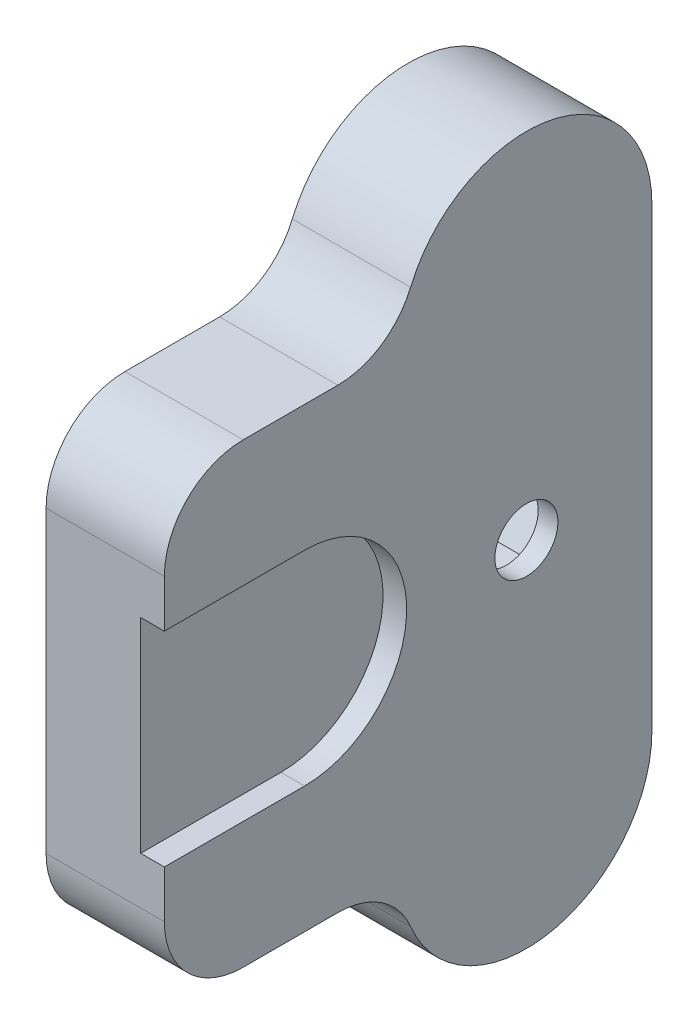
ISO-10303-21;
HEADER;
FILE_DESCRIPTION(('STEP AP214'),'2;1');
FILE_NAME('part.step','',(''),(''),'','','');
FILE_SCHEMA(('AUTOMOTIVE_DESIGN { 1 0 10303 214 1 1 1 1 }'));
ENDSEC;
DATA;
#1=APPLICATION_CONTEXT('core data for automotive mechanical design processes');
#2=APPLICATION_PROTOCOL_DEFINITION('international standard','automotive_design',2000,#1);
#3=PRODUCT_CONTEXT('',#1,'mechanical');
#4=PRODUCT('Part','Part','',(#3));
#5=PRODUCT_RELATED_PRODUCT_CATEGORY('part','',(#4));
#6=PRODUCT_DEFINITION_FORMATION('','',#4);
#7=PRODUCT_DEFINITION_CONTEXT('part definition',#1,'design');
#8=PRODUCT_DEFINITION('design','',#6,#7);
#9=PRODUCT_DEFINITION_SHAPE('','',#8);
#10=(LENGTH_UNIT() NAMED_UNIT(*) SI_UNIT(.MILLI.,.METRE.));
#11=(NAMED_UNIT(*) PLANE_ANGLE_UNIT() SI_UNIT($,.RADIAN.));
#12=(NAMED_UNIT(*) SI_UNIT($,.STERADIAN.) SOLID_ANGLE_UNIT());
#13=UNCERTAINTY_MEASURE_WITH_UNIT(LENGTH_MEASURE(1.E-05),#10,'distance_accuracy_value','');
#14=(GEOMETRIC_REPRESENTATION_CONTEXT(3) GLOBAL_UNCERTAINTY_ASSIGNED_CONTEXT((#13)) GLOBAL_UNIT_ASSIGNED_CONTEXT((#10,
#11,#12)) REPRESENTATION_CONTEXT('',''));
#15=CARTESIAN_POINT('',(0.,0.,0.));
#16=DIRECTION('',(0.,0.,1.));
#17=DIRECTION('',(1.,0.,0.));
#18=AXIS2_PLACEMENT_3D('',#15,#16,#17);
#19=CARTESIAN_POINT('',(15.,-28.9686177509747,3.13232637331732));
#20=DIRECTION('',(-1.,0.,0.));
#21=DIRECTION('',(0.,0.,1.));
#22=AXIS2_PLACEMENT_3D('',#19,#20,#21);
#23=CYLINDRICAL_SURFACE('',#22,15.921660548038);
#24=CARTESIAN_POINT('',(0.,-28.9686177509747,3.13232637331732));
#25=DIRECTION('',(1.,0.,0.));
#26=DIRECTION('',(0.,0.,-1.));
#27=AXIS2_PLACEMENT_3D('',#24,#25,#26);
#28=CIRCLE('',#27,15.921660548038);
#29=CARTESIAN_POINT('',(0.,-35.1108402056403,17.821518928538));
#30=VERTEX_POINT('',#29);
#31=CARTESIAN_POINT('',(0.,-28.9686177509747,-12.7893341747207));
#32=VERTEX_POINT('',#31);
#33=EDGE_CURVE('E253',#30,#32,#28,.T.);
#34=ORIENTED_EDGE('',*,*,#33,.T.);
#35=DIRECTION('',(-1.,0.,0.));
#36=VECTOR('',#35,1.);
#37=CARTESIAN_POINT('',(15.,-28.9686177509747,-12.7893341747207));
#38=LINE('',#37,#36);
#39=CARTESIAN_POINT('',(15.,-28.9686177509747,-12.7893341747207));
#40=VERTEX_POINT('',#39);
#41=EDGE_CURVE('E324',#40,#32,#38,.T.);
#42=ORIENTED_EDGE('',*,*,#41,.F.);
#43=CARTESIAN_POINT('',(15.,-28.9686177509747,3.13232637331732));
#44=DIRECTION('',(1.,0.,0.));
#45=DIRECTION('',(0.,0.,-1.));
#46=AXIS2_PLACEMENT_3D('',#43,#44,#45);
#47=CIRCLE('',#46,15.921660548038);
#48=CARTESIAN_POINT('',(15.,-35.1108402056403,17.821518928538));
#49=VERTEX_POINT('',#48);
#50=EDGE_CURVE('E254',#49,#40,#47,.T.);
#51=ORIENTED_EDGE('',*,*,#50,.F.);
#52=DIRECTION('',(-1.,0.,0.));
#53=VECTOR('',#52,1.);
#54=CARTESIAN_POINT('',(15.,-35.1108402056403,17.821518928538));
#55=LINE('',#54,#53);
#56=EDGE_CURVE('E278',#49,#30,#55,.T.);
#57=ORIENTED_EDGE('',*,*,#56,.T.);
#58=EDGE_LOOP('',(#34,#42,#51,#57));
#59=FACE_BOUND('',#58,.T.);
#60=ADVANCED_FACE('F44',(#59),#23,.T.);
#61=CARTESIAN_POINT('',(15.,-28.9686177509747,-12.7893341747207));
#62=DIRECTION('',(0.,0.,1.));
#63=DIRECTION('',(1.,0.,0.));
#64=AXIS2_PLACEMENT_3D('',#61,#62,#63);
#65=PLANE('',#64);
#66=DIRECTION('',(0.,1.,0.));
#67=VECTOR('',#66,1.);
#68=CARTESIAN_POINT('',(0.,-28.9686177509747,-12.7893341747207));
#69=LINE('',#68,#67);
#70=CARTESIAN_POINT('',(0.,28.9686177509747,-12.7893341747207));
#71=VERTEX_POINT('',#70);
#72=EDGE_CURVE('E281',#32,#71,#69,.T.);
#73=ORIENTED_EDGE('',*,*,#72,.T.);
#74=DIRECTION('',(-1.,0.,0.));
#75=VECTOR('',#74,1.);
#76=CARTESIAN_POINT('',(15.,28.9686177509747,-12.7893341747207));
#77=LINE('',#76,#75);
#78=CARTESIAN_POINT('',(15.,28.9686177509747,-12.7893341747207));
#79=VERTEX_POINT('',#78);
#80=EDGE_CURVE('E321',#79,#71,#77,.T.);
#81=ORIENTED_EDGE('',*,*,#80,.F.);
#82=DIRECTION('',(0.,1.,0.));
#83=VECTOR('',#82,1.);
#84=CARTESIAN_POINT('',(15.,-28.9686177509747,-12.7893341747207));
#85=LINE('',#84,#83);
#86=EDGE_CURVE('E257',#40,#79,#85,.T.);
#87=ORIENTED_EDGE('',*,*,#86,.F.);
#88=ORIENTED_EDGE('',*,*,#41,.T.);
#89=EDGE_LOOP('',(#73,#81,#87,#88));
#90=FACE_BOUND('',#89,.T.);
#91=ADVANCED_FACE('F363',(#90),#65,.F.);
#92=CARTESIAN_POINT('',(15.,28.9686177509747,3.13232637331732));
#93=DIRECTION('',(-1.,0.,0.));
#94=DIRECTION('',(0.,0.,1.));
#95=AXIS2_PLACEMENT_3D('',#92,#93,#94);
#96=CYLINDRICAL_SURFACE('',#95,15.921660548038);
#97=CARTESIAN_POINT('',(0.,28.9686177509747,3.13232637331732));
#98=DIRECTION('',(1.,0.,0.));
#99=DIRECTION('',(0.,0.,1.));
#100=AXIS2_PLACEMENT_3D('',#97,#98,#99);
#101=CIRCLE('',#100,15.921660548038);
#102=CARTESIAN_POINT('',(0.,35.1108402056403,17.821518928538));
#103=VERTEX_POINT('',#102);
#104=EDGE_CURVE('E283',#71,#103,#101,.T.);
#105=ORIENTED_EDGE('',*,*,#104,.T.);
#106=DIRECTION('',(-1.,0.,0.));
#107=VECTOR('',#106,1.);
#108=CARTESIAN_POINT('',(15.,35.1108402056403,17.821518928538));
#109=LINE('',#108,#107);
#110=CARTESIAN_POINT('',(15.,35.1108402056403,17.821518928538));
#111=VERTEX_POINT('',#110);
#112=EDGE_CURVE('E318',#111,#103,#109,.T.);
#113=ORIENTED_EDGE('',*,*,#112,.F.);
#114=CARTESIAN_POINT('',(15.,28.9686177509747,3.13232637331732));
#115=DIRECTION('',(1.,0.,0.));
#116=DIRECTION('',(0.,0.,1.));
#117=AXIS2_PLACEMENT_3D('',#114,#115,#116);
#118=CIRCLE('',#117,15.921660548038);
#119=EDGE_CURVE('E260',#79,#111,#118,.T.);
#120=ORIENTED_EDGE('',*,*,#119,.F.);
#121=ORIENTED_EDGE('',*,*,#80,.T.);
#122=EDGE_LOOP('',(#105,#113,#120,#121));
#123=FACE_BOUND('',#122,.T.);
#124=ADVANCED_FACE('F368',(#123),#96,.T.);
#125=CARTESIAN_POINT('',(15.,38.9686177509747,27.0474363577541));
#126=DIRECTION('',(-1.,0.,0.));
#127=DIRECTION('',(0.,0.,1.));
#128=AXIS2_PLACEMENT_3D('',#125,#126,#127);
#129=CYLINDRICAL_SURFACE('',#128,9.99999999999999);
#130=CARTESIAN_POINT('',(0.,38.9686177509747,27.0474363577541));
#131=DIRECTION('',(-1.,0.,0.));
#132=DIRECTION('',(0.,0.,1.));
#133=AXIS2_PLACEMENT_3D('',#130,#131,#132);
#134=CIRCLE('',#133,9.99999999999999);
#135=CARTESIAN_POINT('',(0.,28.9686177509747,27.0474363577541));
#136=VERTEX_POINT('',#135);
#137=EDGE_CURVE('E285',#103,#136,#134,.T.);
#138=ORIENTED_EDGE('',*,*,#137,.T.);
#139=DIRECTION('',(-1.,0.,0.));
#140=VECTOR('',#139,1.);
#141=CARTESIAN_POINT('',(15.,28.9686177509747,27.0474363577541));
#142=LINE('',#141,#140);
#143=CARTESIAN_POINT('',(15.,28.9686177509747,27.0474363577541));
#144=VERTEX_POINT('',#143);
#145=EDGE_CURVE('E315',#144,#136,#142,.T.);
#146=ORIENTED_EDGE('',*,*,#145,.F.);
#147=CARTESIAN_POINT('',(15.,38.9686177509747,27.0474363577541));
#148=DIRECTION('',(-1.,0.,0.));
#149=DIRECTION('',(0.,0.,1.));
#150=AXIS2_PLACEMENT_3D('',#147,#148,#149);
#151=CIRCLE('',#150,9.99999999999999);
#152=EDGE_CURVE('E262',#111,#144,#151,.T.);
#153=ORIENTED_EDGE('',*,*,#152,.F.);
#154=ORIENTED_EDGE('',*,*,#112,.T.);
#155=EDGE_LOOP('',(#138,#146,#153,#154));
#156=FACE_BOUND('',#155,.T.);
#157=ADVANCED_FACE('F416',(#156),#129,.F.);
#158=CARTESIAN_POINT('',(15.,28.9686177509747,39.0539869213552));
#159=DIRECTION('',(0.,-1.,0.));
#160=DIRECTION('',(0.,0.,-1.));
#161=AXIS2_PLACEMENT_3D('',#158,#159,#160);
#162=PLANE('',#161);
#163=DIRECTION('',(0.,0.,1.));
#164=VECTOR('',#163,1.);
#165=CARTESIAN_POINT('',(0.,28.9686177509747,39.0539869213552));
#166=LINE('',#165,#164);
#167=CARTESIAN_POINT('',(0.,28.9686177509747,39.0539869213552));
#168=VERTEX_POINT('',#167);
#169=EDGE_CURVE('E287',#136,#168,#166,.T.);
#170=ORIENTED_EDGE('',*,*,#169,.T.);
#171=DIRECTION('',(-1.,0.,0.));
#172=VECTOR('',#171,1.);
#173=CARTESIAN_POINT('',(15.,28.9686177509747,39.0539869213552));
#174=LINE('',#173,#172);
#175=CARTESIAN_POINT('',(15.,28.9686177509747,39.0539869213552));
#176=VERTEX_POINT('',#175);
#177=EDGE_CURVE('E312',#176,#168,#174,.T.);
#178=ORIENTED_EDGE('',*,*,#177,.F.);
#179=DIRECTION('',(0.,0.,1.));
#180=VECTOR('',#179,1.);
#181=CARTESIAN_POINT('',(15.,28.9686177509747,39.0539869213552));
#182=LINE('',#181,#180);
#183=EDGE_CURVE('E264',#144,#176,#182,.T.);
#184=ORIENTED_EDGE('',*,*,#183,.F.);
#185=ORIENTED_EDGE('',*,*,#145,.T.);
#186=EDGE_LOOP('',(#170,#178,#184,#185));
#187=FACE_BOUND('',#186,.T.);
#188=ADVANCED_FACE('F411',(#187),#162,.F.);
#189=CARTESIAN_POINT('',(15.,18.9686177509747,39.0539869213552));
#190=DIRECTION('',(-1.,0.,0.));
#191=DIRECTION('',(0.,0.,1.));
#192=AXIS2_PLACEMENT_3D('',#189,#190,#191);
#193=CYLINDRICAL_SURFACE('',#192,10.);
#194=CARTESIAN_POINT('',(0.,18.9686177509747,39.0539869213552));
#195=DIRECTION('',(1.,0.,0.));
#196=DIRECTION('',(0.,0.,1.));
#197=AXIS2_PLACEMENT_3D('',#194,#195,#196);
#198=CIRCLE('',#197,10.);
#199=CARTESIAN_POINT('',(0.,18.9686177509747,49.0539869213552));
#200=VERTEX_POINT('',#199);
#201=EDGE_CURVE('E289',#168,#200,#198,.T.);
#202=ORIENTED_EDGE('',*,*,#201,.T.);
#203=DIRECTION('',(-1.,0.,0.));
#204=VECTOR('',#203,1.);
#205=CARTESIAN_POINT('',(15.,18.9686177509747,49.0539869213552));
#206=LINE('',#205,#204);
#207=CARTESIAN_POINT('',(15.,18.9686177509747,49.0539869213552));
#208=VERTEX_POINT('',#207);
#209=EDGE_CURVE('E309',#208,#200,#206,.T.);
#210=ORIENTED_EDGE('',*,*,#209,.F.);
#211=CARTESIAN_POINT('',(15.,18.9686177509747,39.0539869213552));
#212=DIRECTION('',(1.,0.,0.));
#213=DIRECTION('',(0.,0.,1.));
#214=AXIS2_PLACEMENT_3D('',#211,#212,#213);
#215=CIRCLE('',#214,10.);
#216=EDGE_CURVE('E266',#176,#208,#215,.T.);
#217=ORIENTED_EDGE('',*,*,#216,.F.);
#218=ORIENTED_EDGE('',*,*,#177,.T.);
#219=EDGE_LOOP('',(#202,#210,#217,#218));
#220=FACE_BOUND('',#219,.T.);
#221=ADVANCED_FACE('F407',(#220),#193,.T.);
#222=CARTESIAN_POINT('',(15.,18.9686177509747,49.0539869213552));
#223=DIRECTION('',(0.,0.,-1.));
#224=DIRECTION('',(0.,1.,0.));
#225=AXIS2_PLACEMENT_3D('',#222,#223,#224);
#226=PLANE('',#225);
#227=DIRECTION('',(0.,-1.,0.));
#228=VECTOR('',#227,1.);
#229=CARTESIAN_POINT('',(12.,-12.95,49.0539869213552));
#230=LINE('',#229,#228);
#231=CARTESIAN_POINT('',(12.,12.95,49.0539869213552));
#232=VERTEX_POINT('',#231);
#233=CARTESIAN_POINT('',(12.,-12.95,49.0539869213552));
#234=VERTEX_POINT('',#233);
#235=EDGE_CURVE('E223',#232,#234,#230,.T.);
#236=ORIENTED_EDGE('',*,*,#235,.F.);
#237=DIRECTION('',(1.,0.,0.));
#238=VECTOR('',#237,1.);
#239=CARTESIAN_POINT('',(12.,12.95,49.0539869213552));
#240=LINE('',#239,#238);
#241=CARTESIAN_POINT('',(15.,12.95,49.0539869213552));
#242=VERTEX_POINT('',#241);
#243=EDGE_CURVE('E242',#232,#242,#240,.T.);
#244=ORIENTED_EDGE('',*,*,#243,.T.);
#245=DIRECTION('',(0.,-1.,0.));
#246=VECTOR('',#245,1.);
#247=CARTESIAN_POINT('',(15.,18.9686177509747,49.0539869213552));
#248=LINE('',#247,#246);
#249=EDGE_CURVE('E269',#208,#242,#248,.T.);
#250=ORIENTED_EDGE('',*,*,#249,.F.);
#251=ORIENTED_EDGE('',*,*,#209,.T.);
#252=DIRECTION('',(0.,-1.,0.));
#253=VECTOR('',#252,1.);
#254=CARTESIAN_POINT('',(0.,18.9686177509747,49.0539869213552));
#255=LINE('',#254,#253);
#256=CARTESIAN_POINT('',(0.,-18.9686177509747,49.0539869213552));
#257=VERTEX_POINT('',#256);
#258=EDGE_CURVE('E291',#200,#257,#255,.T.);
#259=ORIENTED_EDGE('',*,*,#258,.T.);
#260=DIRECTION('',(-1.,0.,0.));
#261=VECTOR('',#260,1.);
#262=CARTESIAN_POINT('',(15.,-18.9686177509747,49.0539869213552));
#263=LINE('',#262,#261);
#264=CARTESIAN_POINT('',(15.,-18.9686177509747,49.0539869213552));
#265=VERTEX_POINT('',#264);
#266=EDGE_CURVE('E306',#265,#257,#263,.T.);
#267=ORIENTED_EDGE('',*,*,#266,.F.);
#268=CARTESIAN_POINT('',(15.,-12.95,49.0539869213552));
#269=VERTEX_POINT('',#268);
#270=EDGE_CURVE('E268',#269,#265,#248,.T.);
#271=ORIENTED_EDGE('',*,*,#270,.F.);
#272=DIRECTION('',(1.,0.,0.));
#273=VECTOR('',#272,1.);
#274=CARTESIAN_POINT('',(12.,-12.95,49.0539869213552));
#275=LINE('',#274,#273);
#276=EDGE_CURVE('E66',#234,#269,#275,.T.);
#277=ORIENTED_EDGE('',*,*,#276,.F.);
#278=EDGE_LOOP('',(#236,#244,#250,#251,#259,#267,#271,#277));
#279=FACE_BOUND('',#278,.T.);
#280=ADVANCED_FACE('F402',(#279),#226,.F.);
#281=CARTESIAN_POINT('',(15.,-18.9686177509747,39.0539869213552));
#282=DIRECTION('',(-1.,0.,0.));
#283=DIRECTION('',(0.,0.,1.));
#284=AXIS2_PLACEMENT_3D('',#281,#282,#283);
#285=CYLINDRICAL_SURFACE('',#284,10.);
#286=CARTESIAN_POINT('',(0.,-18.9686177509747,39.0539869213552));
#287=DIRECTION('',(1.,0.,0.));
#288=DIRECTION('',(0.,0.,-1.));
#289=AXIS2_PLACEMENT_3D('',#286,#287,#288);
#290=CIRCLE('',#289,10.);
#291=CARTESIAN_POINT('',(0.,-28.9686177509747,39.0539869213552));
#292=VERTEX_POINT('',#291);
#293=EDGE_CURVE('E293',#257,#292,#290,.T.);
#294=ORIENTED_EDGE('',*,*,#293,.T.);
#295=DIRECTION('',(-1.,0.,0.));
#296=VECTOR('',#295,1.);
#297=CARTESIAN_POINT('',(15.,-28.9686177509747,39.0539869213552));
#298=LINE('',#297,#296);
#299=CARTESIAN_POINT('',(15.,-28.9686177509747,39.0539869213552));
#300=VERTEX_POINT('',#299);
#301=EDGE_CURVE('E303',#300,#292,#298,.T.);
#302=ORIENTED_EDGE('',*,*,#301,.F.);
#303=CARTESIAN_POINT('',(15.,-18.9686177509747,39.0539869213552));
#304=DIRECTION('',(1.,0.,0.));
#305=DIRECTION('',(0.,0.,-1.));
#306=AXIS2_PLACEMENT_3D('',#303,#304,#305);
#307=CIRCLE('',#306,10.);
#308=EDGE_CURVE('E272',#265,#300,#307,.T.);
#309=ORIENTED_EDGE('',*,*,#308,.F.);
#310=ORIENTED_EDGE('',*,*,#266,.T.);
#311=EDGE_LOOP('',(#294,#302,#309,#310));
#312=FACE_BOUND('',#311,.T.);
#313=ADVANCED_FACE('F396',(#312),#285,.T.);
#314=CARTESIAN_POINT('',(15.,-28.9686177509747,39.0539869213552));
#315=DIRECTION('',(0.,1.,0.));
#316=DIRECTION('',(0.,0.,1.));
#317=AXIS2_PLACEMENT_3D('',#314,#315,#316);
#318=PLANE('',#317);
#319=DIRECTION('',(0.,0.,-1.));
#320=VECTOR('',#319,1.);
#321=CARTESIAN_POINT('',(0.,-28.9686177509747,39.0539869213552));
#322=LINE('',#321,#320);
#323=CARTESIAN_POINT('',(0.,-28.9686177509747,27.0474363577541));
#324=VERTEX_POINT('',#323);
#325=EDGE_CURVE('E295',#292,#324,#322,.T.);
#326=ORIENTED_EDGE('',*,*,#325,.T.);
#327=DIRECTION('',(-1.,0.,0.));
#328=VECTOR('',#327,1.);
#329=CARTESIAN_POINT('',(15.,-28.9686177509747,27.0474363577541));
#330=LINE('',#329,#328);
#331=CARTESIAN_POINT('',(15.,-28.9686177509747,27.0474363577541));
#332=VERTEX_POINT('',#331);
#333=EDGE_CURVE('E300',#332,#324,#330,.T.);
#334=ORIENTED_EDGE('',*,*,#333,.F.);
#335=DIRECTION('',(0.,0.,-1.));
#336=VECTOR('',#335,1.);
#337=CARTESIAN_POINT('',(15.,-28.9686177509747,39.0539869213552));
#338=LINE('',#337,#336);
#339=EDGE_CURVE('E274',#300,#332,#338,.T.);
#340=ORIENTED_EDGE('',*,*,#339,.F.);
#341=ORIENTED_EDGE('',*,*,#301,.T.);
#342=EDGE_LOOP('',(#326,#334,#340,#341));
#343=FACE_BOUND('',#342,.T.);
#344=ADVANCED_FACE('F390',(#343),#318,.F.);
#345=CARTESIAN_POINT('',(15.,-38.9686177509747,27.0474363577541));
#346=DIRECTION('',(-1.,0.,0.));
#347=DIRECTION('',(0.,0.,1.));
#348=AXIS2_PLACEMENT_3D('',#345,#346,#347);
#349=CYLINDRICAL_SURFACE('',#348,9.99999999999999);
#350=CARTESIAN_POINT('',(0.,-38.9686177509747,27.0474363577541));
#351=DIRECTION('',(-1.,0.,0.));
#352=DIRECTION('',(0.,0.,-1.));
#353=AXIS2_PLACEMENT_3D('',#350,#351,#352);
#354=CIRCLE('',#353,9.99999999999999);
#355=EDGE_CURVE('E258',#324,#30,#354,.T.);
#356=ORIENTED_EDGE('',*,*,#355,.T.);
#357=ORIENTED_EDGE('',*,*,#56,.F.);
#358=CARTESIAN_POINT('',(15.,-38.9686177509747,27.0474363577541));
#359=DIRECTION('',(-1.,0.,0.));
#360=DIRECTION('',(0.,0.,-1.));
#361=AXIS2_PLACEMENT_3D('',#358,#359,#360);
#362=CIRCLE('',#361,9.99999999999999);
#363=EDGE_CURVE('E276',#332,#49,#362,.T.);
#364=ORIENTED_EDGE('',*,*,#363,.F.);
#365=ORIENTED_EDGE('',*,*,#333,.T.);
#366=EDGE_LOOP('',(#356,#357,#364,#365));
#367=FACE_BOUND('',#366,.T.);
#368=ADVANCED_FACE('F388',(#367),#349,.F.);
#369=CARTESIAN_POINT('',(15.,-28.9686177509747,3.13232637331732));
#370=DIRECTION('',(1.,0.,0.));
#371=DIRECTION('',(0.,0.,-1.));
#372=AXIS2_PLACEMENT_3D('',#369,#370,#371);
#373=PLANE('',#372);
#374=DIRECTION('',(0.,0.,1.));
#375=VECTOR('',#374,1.);
#376=CARTESIAN_POINT('',(15.,12.95,31.2677038838304));
#377=LINE('',#376,#375);
#378=CARTESIAN_POINT('',(15.,12.95,31.2677038838304));
#379=VERTEX_POINT('',#378);
#380=EDGE_CURVE('E227',#379,#242,#377,.T.);
#381=ORIENTED_EDGE('',*,*,#380,.F.);
#382=CARTESIAN_POINT('',(15.,0.,31.2677038838304));
#383=DIRECTION('',(1.,0.,0.));
#384=DIRECTION('',(0.,0.,-1.));
#385=AXIS2_PLACEMENT_3D('',#382,#383,#384);
#386=CIRCLE('',#385,12.95);
#387=CARTESIAN_POINT('',(15.,-12.95,31.2677038838304));
#388=VERTEX_POINT('',#387);
#389=EDGE_CURVE('E238',#388,#379,#386,.T.);
#390=ORIENTED_EDGE('',*,*,#389,.F.);
#391=DIRECTION('',(0.,0.,-1.));
#392=VECTOR('',#391,1.);
#393=CARTESIAN_POINT('',(15.,-12.95,49.0539869213552));
#394=LINE('',#393,#392);
#395=EDGE_CURVE('E236',#269,#388,#394,.T.);
#396=ORIENTED_EDGE('',*,*,#395,.F.);
#397=ORIENTED_EDGE('',*,*,#270,.T.);
#398=ORIENTED_EDGE('',*,*,#308,.T.);
#399=ORIENTED_EDGE('',*,*,#339,.T.);
#400=ORIENTED_EDGE('',*,*,#363,.T.);
#401=ORIENTED_EDGE('',*,*,#50,.T.);
#402=ORIENTED_EDGE('',*,*,#86,.T.);
#403=ORIENTED_EDGE('',*,*,#119,.T.);
#404=ORIENTED_EDGE('',*,*,#152,.T.);
#405=ORIENTED_EDGE('',*,*,#183,.T.);
#406=ORIENTED_EDGE('',*,*,#216,.T.);
#407=ORIENTED_EDGE('',*,*,#249,.T.);
#408=EDGE_LOOP('',(#381,#390,#396,#397,#398,#399,#400,#401,#402,#403,#404,#405,#406,#407));
#409=FACE_BOUND('',#408,.T.);
#410=CARTESIAN_POINT('',(15.,0.,3.13232637331727));
#411=DIRECTION('',(1.,0.,0.));
#412=DIRECTION('',(0.,0.,-1.));
#413=AXIS2_PLACEMENT_3D('',#410,#411,#412);
#414=CIRCLE('',#413,4.);
#415=CARTESIAN_POINT('',(15.,0.,-0.867673626682733));
#416=VERTEX_POINT('',#415);
#417=EDGE_CURVE('E245',#416,#416,#414,.T.);
#418=ORIENTED_EDGE('',*,*,#417,.F.);
#419=EDGE_LOOP('',(#418));
#420=FACE_BOUND('',#419,.T.);
#421=ADVANCED_FACE('F382',(#409,#420),#373,.T.);
#422=CARTESIAN_POINT('',(0.,-28.9686177509747,3.13232637331732));
#423=DIRECTION('',(1.,0.,0.));
#424=DIRECTION('',(0.,0.,-1.));
#425=AXIS2_PLACEMENT_3D('',#422,#423,#424);
#426=PLANE('',#425);
#427=DIRECTION('',(0.,0.845327020739453,0.534249219005289));
#428=VECTOR('',#427,1.);
#429=CARTESIAN_POINT('',(0.,-17.7085347037566,-14.684175957385));
#430=LINE('',#429,#428);
#431=CARTESIAN_POINT('',(0.,0.258716841757371,-3.32881895310315));
#432=VERTEX_POINT('',#431);
#433=CARTESIAN_POINT('',(0.,5.72487441110187,0.125809067455821));
#434=VERTEX_POINT('',#433);
#435=EDGE_CURVE('E51',#432,#434,#430,.T.);
#436=ORIENTED_EDGE('',*,*,#435,.T.);
#437=DIRECTION('',(0.,-0.040009885240851,0.999199283968426));
#438=VECTOR('',#437,1.);
#439=CARTESIAN_POINT('',(0.,5.54914329004977,4.51448474770838));
#440=LINE('',#439,#438);
#441=CARTESIAN_POINT('',(0.,5.4661575693445,6.58695439387624));
#442=VERTEX_POINT('',#441);
#443=EDGE_CURVE('E11',#434,#442,#440,.T.);
#444=ORIENTED_EDGE('',*,*,#443,.T.);
#445=DIRECTION('',(0.,-0.885336905980303,0.464950064963136));
#446=VECTOR('',#445,1.);
#447=CARTESIAN_POINT('',(0.,-20.1025032323088,20.014781044326));
#448=LINE('',#447,#446);
#449=CARTESIAN_POINT('',(0.,-0.258716841757364,9.59347169973769));
#450=VERTEX_POINT('',#449);
#451=EDGE_CURVE('E184',#442,#450,#448,.T.);
#452=ORIENTED_EDGE('',*,*,#451,.T.);
#453=DIRECTION('',(0.,-0.845327020739452,-0.53424921900529));
#454=VECTOR('',#453,1.);
#455=CARTESIAN_POINT('',(0.,-23.6921259566159,-5.21651332510313));
#456=LINE('',#455,#454);
#457=CARTESIAN_POINT('',(0.,-5.72487441110187,6.13884367917871));
#458=VERTEX_POINT('',#457);
#459=EDGE_CURVE('E330',#450,#458,#456,.T.);
#460=ORIENTED_EDGE('',*,*,#459,.T.);
#461=DIRECTION('',(0.,0.0400098852408509,-0.999199283968426));
#462=VECTOR('',#461,1.);
#463=CARTESIAN_POINT('',(0.,-5.64188869039658,4.06637403301085));
#464=LINE('',#463,#462);
#465=CARTESIAN_POINT('',(0.,-5.46615756934448,-0.322301647241716));
#466=VERTEX_POINT('',#465);
#467=EDGE_CURVE('E333',#458,#466,#464,.T.);
#468=ORIENTED_EDGE('',*,*,#467,.T.);
#469=DIRECTION('',(0.,0.885336905980303,-0.464950064963136));
#470=VECTOR('',#469,1.);
#471=CARTESIAN_POINT('',(0.,-25.3099439598959,10.0990076973466));
#472=LINE('',#471,#470);
#473=EDGE_CURVE('E336',#466,#432,#472,.T.);
#474=ORIENTED_EDGE('',*,*,#473,.T.);
#475=EDGE_LOOP('',(#436,#444,#452,#460,#468,#474));
#476=FACE_BOUND('',#475,.T.);
#477=ORIENTED_EDGE('',*,*,#33,.F.);
#478=ORIENTED_EDGE('',*,*,#355,.F.);
#479=ORIENTED_EDGE('',*,*,#325,.F.);
#480=ORIENTED_EDGE('',*,*,#293,.F.);
#481=ORIENTED_EDGE('',*,*,#258,.F.);
#482=ORIENTED_EDGE('',*,*,#201,.F.);
#483=ORIENTED_EDGE('',*,*,#169,.F.);
#484=ORIENTED_EDGE('',*,*,#137,.F.);
#485=ORIENTED_EDGE('',*,*,#104,.F.);
#486=ORIENTED_EDGE('',*,*,#72,.F.);
#487=EDGE_LOOP('',(#477,#478,#479,#480,#481,#482,#483,#484,#485,#486));
#488=FACE_BOUND('',#487,.T.);
#489=ADVANCED_FACE('F340',(#476,#488),#426,.F.);
#490=CARTESIAN_POINT('',(0.953799999999999,0.,3.13232637331727));
#491=DIRECTION('',(1.,0.,0.));
#492=DIRECTION('',(0.,0.,-1.));
#493=AXIS2_PLACEMENT_3D('',#490,#491,#492);
#494=CYLINDRICAL_SURFACE('',#493,4.);
#495=CARTESIAN_POINT('',(12.5,0.,3.13232637331727));
#496=DIRECTION('',(1.,0.,0.));
#497=DIRECTION('',(0.,0.,-1.));
#498=AXIS2_PLACEMENT_3D('',#495,#496,#497);
#499=CIRCLE('',#498,4.);
#500=CARTESIAN_POINT('',(12.5,0.,-0.867673626682733));
#501=VERTEX_POINT('',#500);
#502=EDGE_CURVE('E215',#501,#501,#499,.F.);
#503=CARTESIAN_POINT('',(12.5,0.,-0.867673626682733));
#504=CARTESIAN_POINT('',(12.5260416666667,0.,-0.867673626682733));
#505=CARTESIAN_POINT('',(12.5520833333333,0.,-0.867673626682733));
#506=CARTESIAN_POINT('',(12.6041666666667,0.,-0.867673626682733));
#507=CARTESIAN_POINT('',(12.6302083333333,0.,-0.867673626682733));
#508=CARTESIAN_POINT('',(12.6822916666667,0.,-0.867673626682733));
#509=CARTESIAN_POINT('',(12.7083333333333,0.,-0.867673626682733));
#510=CARTESIAN_POINT('',(12.7604166666667,0.,-0.867673626682733));
#511=CARTESIAN_POINT('',(12.7864583333333,0.,-0.867673626682733));
#512=CARTESIAN_POINT('',(12.8385416666667,0.,-0.867673626682733));
#513=CARTESIAN_POINT('',(12.8645833333333,0.,-0.867673626682733));
#514=CARTESIAN_POINT('',(12.9166666666667,0.,-0.867673626682733));
#515=CARTESIAN_POINT('',(12.9427083333333,0.,-0.867673626682733));
#516=CARTESIAN_POINT('',(12.9947916666667,0.,-0.867673626682733));
#517=CARTESIAN_POINT('',(13.0208333333333,0.,-0.867673626682733));
#518=CARTESIAN_POINT('',(13.0729166666667,0.,-0.867673626682733));
#519=CARTESIAN_POINT('',(13.0989583333333,0.,-0.867673626682733));
#520=CARTESIAN_POINT('',(13.1510416666667,0.,-0.867673626682733));
#521=CARTESIAN_POINT('',(13.1770833333333,0.,-0.867673626682733));
#522=CARTESIAN_POINT('',(13.2291666666667,0.,-0.867673626682733));
#523=CARTESIAN_POINT('',(13.2552083333333,0.,-0.867673626682733));
#524=CARTESIAN_POINT('',(13.3072916666667,0.,-0.867673626682733));
#525=CARTESIAN_POINT('',(13.3333333333333,0.,-0.867673626682733));
#526=CARTESIAN_POINT('',(13.3854166666667,0.,-0.867673626682733));
#527=CARTESIAN_POINT('',(13.4114583333333,0.,-0.867673626682733));
#528=CARTESIAN_POINT('',(13.4635416666667,0.,-0.867673626682733));
#529=CARTESIAN_POINT('',(13.4895833333333,0.,-0.867673626682733));
#530=CARTESIAN_POINT('',(13.5416666666667,0.,-0.867673626682733));
#531=CARTESIAN_POINT('',(13.5677083333333,0.,-0.867673626682733));
#532=CARTESIAN_POINT('',(13.6197916666667,0.,-0.867673626682733));
#533=CARTESIAN_POINT('',(13.6458333333333,0.,-0.867673626682733));
#534=CARTESIAN_POINT('',(13.6979166666667,0.,-0.867673626682733));
#535=CARTESIAN_POINT('',(13.7239583333333,0.,-0.867673626682733));
#536=CARTESIAN_POINT('',(13.7760416666667,0.,-0.867673626682733));
#537=CARTESIAN_POINT('',(13.8020833333333,0.,-0.867673626682733));
#538=CARTESIAN_POINT('',(13.8541666666667,0.,-0.867673626682733));
#539=CARTESIAN_POINT('',(13.8802083333333,0.,-0.867673626682733));
#540=CARTESIAN_POINT('',(13.9322916666667,0.,-0.867673626682733));
#541=CARTESIAN_POINT('',(13.9583333333333,0.,-0.867673626682733));
#542=CARTESIAN_POINT('',(14.0104166666667,0.,-0.867673626682733));
#543=CARTESIAN_POINT('',(14.0364583333333,0.,-0.867673626682733));
#544=CARTESIAN_POINT('',(14.0885416666667,0.,-0.867673626682733));
#545=CARTESIAN_POINT('',(14.1145833333333,0.,-0.867673626682733));
#546=CARTESIAN_POINT('',(14.1666666666667,0.,-0.867673626682733));
#547=CARTESIAN_POINT('',(14.1927083333333,0.,-0.867673626682733));
#548=CARTESIAN_POINT('',(14.2447916666667,0.,-0.867673626682733));
#549=CARTESIAN_POINT('',(14.2708333333333,0.,-0.867673626682733));
#550=CARTESIAN_POINT('',(14.3229166666667,0.,-0.867673626682733));
#551=CARTESIAN_POINT('',(14.3489583333333,0.,-0.867673626682733));
#552=CARTESIAN_POINT('',(14.4010416666667,0.,-0.867673626682733));
#553=CARTESIAN_POINT('',(14.4270833333333,0.,-0.867673626682733));
#554=CARTESIAN_POINT('',(14.4791666666667,0.,-0.867673626682733));
#555=CARTESIAN_POINT('',(14.5052083333333,0.,-0.867673626682733));
#556=CARTESIAN_POINT('',(14.5572916666667,0.,-0.867673626682733));
#557=CARTESIAN_POINT('',(14.5833333333333,0.,-0.867673626682733));
#558=CARTESIAN_POINT('',(14.6354166666667,0.,-0.867673626682733));
#559=CARTESIAN_POINT('',(14.6614583333333,0.,-0.867673626682733));
#560=CARTESIAN_POINT('',(14.7135416666667,0.,-0.867673626682733));
#561=CARTESIAN_POINT('',(14.7395833333333,0.,-0.867673626682733));
#562=CARTESIAN_POINT('',(14.7916666666667,0.,-0.867673626682733));
#563=CARTESIAN_POINT('',(14.8177083333333,0.,-0.867673626682733));
#564=CARTESIAN_POINT('',(14.8697916666667,0.,-0.867673626682733));
#565=CARTESIAN_POINT('',(14.8958333333333,0.,-0.867673626682733));
#566=CARTESIAN_POINT('',(14.9479166666667,0.,-0.867673626682733));
#567=CARTESIAN_POINT('',(14.9739583333333,0.,-0.867673626682733));
#568=CARTESIAN_POINT('',(15.,0.,-0.867673626682733));
#569=B_SPLINE_CURVE_WITH_KNOTS('',3,(#503,#504,#505,#506,#507,#508,#509,#510,#511,#512,#513,
#514,#515,#516,#517,#518,#519,#520,#521,#522,#523,#524,#525,#526,#527,#528,#529,#530,#531,#532,
#533,#534,#535,#536,#537,#538,#539,#540,#541,#542,#543,#544,#545,#546,#547,#548,#549,#550,#551,
#552,#553,#554,#555,#556,#557,#558,#559,#560,#561,#562,#563,#564,#565,#566,#567,#568),
.UNSPECIFIED.,.F.,.F.,(4,2,2,2,2,2,2,2,2,2,2,2,2,2,2,2,2,2,2,2,2,2,2,2,2,2,2,2,2,2,2,2,4),(0.,
0.0781250000000001,0.15625,0.234375,0.3125,0.390625,0.46875,0.546875,0.625000000000001,
0.703124999999999,0.781249999999999,0.859374999999999,0.937499999999999,1.015625,1.09375,
1.171875,1.25,1.328125,1.40625,1.484375,1.5625,1.640625,1.71875,1.796875,1.875,1.953125,2.03125,
2.109375,2.1875,2.265625,2.34375,2.421875,2.5),.UNSPECIFIED.);
#570=EDGE_CURVE('BSEAM439',#501,#416,#569,.T.);
#571=ORIENTED_EDGE('',*,*,#502,.T.);
#572=ORIENTED_EDGE('',*,*,#417,.T.);
#573=ORIENTED_EDGE('',*,*,#570,.T.);
#574=ORIENTED_EDGE('',*,*,#570,.F.);
#575=EDGE_LOOP('',(#571,#573,#572,#574));
#576=FACE_BOUND('',#575,.T.);
#577=ADVANCED_FACE('F439',(#576),#494,.F.);
#578=CARTESIAN_POINT('',(12.,12.95,31.2677038838304));
#579=DIRECTION('',(0.,1.,0.));
#580=DIRECTION('',(0.,0.,1.));
#581=AXIS2_PLACEMENT_3D('',#578,#579,#580);
#582=PLANE('',#581);
#583=ORIENTED_EDGE('',*,*,#380,.T.);
#584=ORIENTED_EDGE('',*,*,#243,.F.);
#585=DIRECTION('',(0.,0.,1.));
#586=VECTOR('',#585,1.);
#587=CARTESIAN_POINT('',(12.,12.95,31.2677038838304));
#588=LINE('',#587,#586);
#589=CARTESIAN_POINT('',(12.,12.95,31.2677038838304));
#590=VERTEX_POINT('',#589);
#591=EDGE_CURVE('E233',#590,#232,#588,.T.);
#592=ORIENTED_EDGE('',*,*,#591,.F.);
#593=DIRECTION('',(1.,0.,0.));
#594=VECTOR('',#593,1.);
#595=CARTESIAN_POINT('',(12.,12.95,31.2677038838304));
#596=LINE('',#595,#594);
#597=EDGE_CURVE('E246',#590,#379,#596,.T.);
#598=ORIENTED_EDGE('',*,*,#597,.T.);
#599=EDGE_LOOP('',(#583,#584,#592,#598));
#600=FACE_BOUND('',#599,.T.);
#601=ADVANCED_FACE('F421',(#600),#582,.F.);
#602=CARTESIAN_POINT('',(12.,0.,31.2677038838304));
#603=DIRECTION('',(1.,0.,0.));
#604=DIRECTION('',(0.,0.,-1.));
#605=AXIS2_PLACEMENT_3D('',#602,#603,#604);
#606=CYLINDRICAL_SURFACE('',#605,12.95);
#607=ORIENTED_EDGE('',*,*,#389,.T.);
#608=ORIENTED_EDGE('',*,*,#597,.F.);
#609=CARTESIAN_POINT('',(12.,0.,31.2677038838304));
#610=DIRECTION('',(1.,0.,0.));
#611=DIRECTION('',(0.,0.,-1.));
#612=AXIS2_PLACEMENT_3D('',#609,#610,#611);
#613=CIRCLE('',#612,12.95);
#614=CARTESIAN_POINT('',(12.,-12.95,31.2677038838304));
#615=VERTEX_POINT('',#614);
#616=EDGE_CURVE('E230',#615,#590,#613,.T.);
#617=ORIENTED_EDGE('',*,*,#616,.F.);
#618=DIRECTION('',(1.,0.,0.));
#619=VECTOR('',#618,1.);
#620=CARTESIAN_POINT('',(12.,-12.95,31.2677038838304));
#621=LINE('',#620,#619);
#622=EDGE_CURVE('E248',#615,#388,#621,.T.);
#623=ORIENTED_EDGE('',*,*,#622,.T.);
#624=EDGE_LOOP('',(#607,#608,#617,#623));
#625=FACE_BOUND('',#624,.T.);
#626=ADVANCED_FACE('F427',(#625),#606,.F.);
#627=CARTESIAN_POINT('',(12.,-12.95,49.0539869213552));
#628=DIRECTION('',(0.,-1.,0.));
#629=DIRECTION('',(0.,0.,-1.));
#630=AXIS2_PLACEMENT_3D('',#627,#628,#629);
#631=PLANE('',#630);
#632=ORIENTED_EDGE('',*,*,#395,.T.);
#633=ORIENTED_EDGE('',*,*,#622,.F.);
#634=DIRECTION('',(0.,0.,-1.));
#635=VECTOR('',#634,1.);
#636=CARTESIAN_POINT('',(12.,-12.95,49.0539869213552));
#637=LINE('',#636,#635);
#638=EDGE_CURVE('E226',#234,#615,#637,.T.);
#639=ORIENTED_EDGE('',*,*,#638,.F.);
#640=ORIENTED_EDGE('',*,*,#276,.T.);
#641=EDGE_LOOP('',(#632,#633,#639,#640));
#642=FACE_BOUND('',#641,.T.);
#643=ADVANCED_FACE('F428',(#642),#631,.F.);
#644=CARTESIAN_POINT('',(12.,0.,31.2677038838304));
#645=DIRECTION('',(1.,0.,0.));
#646=DIRECTION('',(0.,0.,-1.));
#647=AXIS2_PLACEMENT_3D('',#644,#645,#646);
#648=PLANE('',#647);
#649=ORIENTED_EDGE('',*,*,#235,.T.);
#650=ORIENTED_EDGE('',*,*,#638,.T.);
#651=ORIENTED_EDGE('',*,*,#616,.T.);
#652=ORIENTED_EDGE('',*,*,#591,.T.);
#653=EDGE_LOOP('',(#649,#650,#651,#652));
#654=FACE_BOUND('',#653,.T.);
#655=ADVANCED_FACE('F424',(#654),#648,.T.);
#656=CARTESIAN_POINT('',(-12.5,5.54914329004977,4.51448474770838));
#657=DIRECTION('',(0.,0.999199283968425,0.040009885240851));
#658=DIRECTION('',(0.,-0.040009885240851,0.999199283968426));
#659=AXIS2_PLACEMENT_3D('',#656,#657,#658);
#660=PLANE('',#659);
#661=DIRECTION('',(1.,0.,0.));
#662=VECTOR('',#661,1.);
#663=CARTESIAN_POINT('',(-12.5,5.72487441110187,0.125809067455821));
#664=LINE('',#663,#662);
#665=CARTESIAN_POINT('',(12.5,5.72487441110187,0.125809067455821));
#666=VERTEX_POINT('',#665);
#667=EDGE_CURVE('E203',#434,#666,#664,.T.);
#668=ORIENTED_EDGE('',*,*,#667,.T.);
#669=DIRECTION('',(0.,-0.040009885240851,0.999199283968426));
#670=VECTOR('',#669,1.);
#671=CARTESIAN_POINT('',(12.5,5.54914329004977,4.51448474770838));
#672=LINE('',#671,#670);
#673=CARTESIAN_POINT('',(12.5,5.4661575693445,6.58695439387624));
#674=VERTEX_POINT('',#673);
#675=EDGE_CURVE('E195',#666,#674,#672,.T.);
#676=ORIENTED_EDGE('',*,*,#675,.T.);
#677=DIRECTION('',(1.,0.,0.));
#678=VECTOR('',#677,1.);
#679=CARTESIAN_POINT('',(-12.5,5.4661575693445,6.58695439387624));
#680=LINE('',#679,#678);
#681=EDGE_CURVE('E179',#442,#674,#680,.T.);
#682=ORIENTED_EDGE('',*,*,#681,.F.);
#683=ORIENTED_EDGE('',*,*,#443,.F.);
#684=EDGE_LOOP('',(#668,#676,#682,#683));
#685=FACE_BOUND('',#684,.T.);
#686=ADVANCED_FACE('F201',(#685),#660,.F.);
#687=CARTESIAN_POINT('',(-12.5,-17.7085347037566,-14.684175957385));
#688=DIRECTION('',(0.,0.534249219005289,-0.845327020739453));
#689=DIRECTION('',(0.,0.845327020739453,0.534249219005289));
#690=AXIS2_PLACEMENT_3D('',#687,#688,#689);
#691=PLANE('',#690);
#692=DIRECTION('',(1.,0.,0.));
#693=VECTOR('',#692,1.);
#694=CARTESIAN_POINT('',(-12.5,0.258716841757371,-3.32881895310315));
#695=LINE('',#694,#693);
#696=CARTESIAN_POINT('',(12.5,0.258716841757371,-3.32881895310315));
#697=VERTEX_POINT('',#696);
#698=EDGE_CURVE('E216',#432,#697,#695,.T.);
#699=ORIENTED_EDGE('',*,*,#698,.T.);
#700=DIRECTION('',(0.,0.845327020739452,0.534249219005289));
#701=VECTOR('',#700,1.);
#702=CARTESIAN_POINT('',(12.5,-17.7085347037566,-14.684175957385));
#703=LINE('',#702,#701);
#704=EDGE_CURVE('E187',#697,#666,#703,.T.);
#705=ORIENTED_EDGE('',*,*,#704,.T.);
#706=ORIENTED_EDGE('',*,*,#667,.F.);
#707=ORIENTED_EDGE('',*,*,#435,.F.);
#708=EDGE_LOOP('',(#699,#705,#706,#707));
#709=FACE_BOUND('',#708,.T.);
#710=ADVANCED_FACE('F344',(#709),#691,.F.);
#711=CARTESIAN_POINT('',(-12.5,-25.3099439598959,10.0990076973466));
#712=DIRECTION('',(0.,-0.464950064963136,-0.885336905980303));
#713=DIRECTION('',(0.,0.885336905980303,-0.464950064963136));
#714=AXIS2_PLACEMENT_3D('',#711,#712,#713);
#715=PLANE('',#714);
#716=DIRECTION('',(1.,0.,0.));
#717=VECTOR('',#716,1.);
#718=CARTESIAN_POINT('',(-12.5,-5.46615756934448,-0.322301647241716));
#719=LINE('',#718,#717);
#720=CARTESIAN_POINT('',(12.5,-5.46615756934448,-0.322301647241716));
#721=VERTEX_POINT('',#720);
#722=EDGE_CURVE('E218',#466,#721,#719,.T.);
#723=ORIENTED_EDGE('',*,*,#722,.T.);
#724=DIRECTION('',(0.,0.885336905980303,-0.464950064963136));
#725=VECTOR('',#724,1.);
#726=CARTESIAN_POINT('',(12.5,-25.3099439598959,10.0990076973466));
#727=LINE('',#726,#725);
#728=EDGE_CURVE('E210',#721,#697,#727,.T.);
#729=ORIENTED_EDGE('',*,*,#728,.T.);
#730=ORIENTED_EDGE('',*,*,#698,.F.);
#731=ORIENTED_EDGE('',*,*,#473,.F.);
#732=EDGE_LOOP('',(#723,#729,#730,#731));
#733=FACE_BOUND('',#732,.T.);
#734=ADVANCED_FACE('F346',(#733),#715,.F.);
#735=CARTESIAN_POINT('',(-12.5,-5.64188869039658,4.06637403301084));
#736=DIRECTION('',(0.,-0.999199283968425,-0.0400098852408509));
#737=DIRECTION('',(0.,0.0400098852408509,-0.999199283968426));
#738=AXIS2_PLACEMENT_3D('',#735,#736,#737);
#739=PLANE('',#738);
#740=DIRECTION('',(1.,0.,0.));
#741=VECTOR('',#740,1.);
#742=CARTESIAN_POINT('',(-12.5,-5.72487441110187,6.13884367917871));
#743=LINE('',#742,#741);
#744=CARTESIAN_POINT('',(12.5,-5.72487441110187,6.13884367917871));
#745=VERTEX_POINT('',#744);
#746=EDGE_CURVE('E220',#458,#745,#743,.T.);
#747=ORIENTED_EDGE('',*,*,#746,.T.);
#748=DIRECTION('',(0.,0.0400098852408509,-0.999199283968426));
#749=VECTOR('',#748,1.);
#750=CARTESIAN_POINT('',(12.5,-5.64188869039658,4.06637403301084));
#751=LINE('',#750,#749);
#752=EDGE_CURVE('E207',#745,#721,#751,.T.);
#753=ORIENTED_EDGE('',*,*,#752,.T.);
#754=ORIENTED_EDGE('',*,*,#722,.F.);
#755=ORIENTED_EDGE('',*,*,#467,.F.);
#756=EDGE_LOOP('',(#747,#753,#754,#755));
#757=FACE_BOUND('',#756,.T.);
#758=ADVANCED_FACE('F350',(#757),#739,.F.);
#759=CARTESIAN_POINT('',(-12.5,-23.6921259566159,-5.21651332510313));
#760=DIRECTION('',(0.,-0.53424921900529,0.845327020739452));
#761=DIRECTION('',(0.,-0.845327020739452,-0.53424921900529));
#762=AXIS2_PLACEMENT_3D('',#759,#760,#761);
#763=PLANE('',#762);
#764=DIRECTION('',(1.,0.,0.));
#765=VECTOR('',#764,1.);
#766=CARTESIAN_POINT('',(-12.5,-0.258716841757364,9.59347169973769));
#767=LINE('',#766,#765);
#768=CARTESIAN_POINT('',(12.5,-0.258716841757364,9.59347169973769));
#769=VERTEX_POINT('',#768);
#770=EDGE_CURVE('E58',#450,#769,#767,.T.);
#771=ORIENTED_EDGE('',*,*,#770,.T.);
#772=DIRECTION('',(0.,-0.845327020739452,-0.53424921900529));
#773=VECTOR('',#772,1.);
#774=CARTESIAN_POINT('',(12.5,-23.6921259566159,-5.21651332510313));
#775=LINE('',#774,#773);
#776=EDGE_CURVE('E199',#769,#745,#775,.T.);
#777=ORIENTED_EDGE('',*,*,#776,.T.);
#778=ORIENTED_EDGE('',*,*,#746,.F.);
#779=ORIENTED_EDGE('',*,*,#459,.F.);
#780=EDGE_LOOP('',(#771,#777,#778,#779));
#781=FACE_BOUND('',#780,.T.);
#782=ADVANCED_FACE('F353',(#781),#763,.F.);
#783=CARTESIAN_POINT('',(-12.5,-20.1025032323088,20.014781044326));
#784=DIRECTION('',(0.,0.464950064963136,0.885336905980303));
#785=DIRECTION('',(0.,-0.885336905980303,0.464950064963136));
#786=AXIS2_PLACEMENT_3D('',#783,#784,#785);
#787=PLANE('',#786);
#788=ORIENTED_EDGE('',*,*,#681,.T.);
#789=DIRECTION('',(0.,-0.885336905980303,0.464950064963136));
#790=VECTOR('',#789,1.);
#791=CARTESIAN_POINT('',(12.5,-20.1025032323088,20.014781044326));
#792=LINE('',#791,#790);
#793=EDGE_CURVE('E182',#674,#769,#792,.T.);
#794=ORIENTED_EDGE('',*,*,#793,.T.);
#795=ORIENTED_EDGE('',*,*,#770,.F.);
#796=ORIENTED_EDGE('',*,*,#451,.F.);
#797=EDGE_LOOP('',(#788,#794,#795,#796));
#798=FACE_BOUND('',#797,.T.);
#799=ADVANCED_FACE('F181',(#798),#787,.F.);
#800=CARTESIAN_POINT('',(12.5,0.,0.));
#801=DIRECTION('',(1.,0.,0.));
#802=DIRECTION('',(0.,0.,-1.));
#803=AXIS2_PLACEMENT_3D('',#800,#801,#802);
#804=PLANE('',#803);
#805=ORIENTED_EDGE('',*,*,#675,.F.);
#806=ORIENTED_EDGE('',*,*,#704,.F.);
#807=ORIENTED_EDGE('',*,*,#728,.F.);
#808=ORIENTED_EDGE('',*,*,#752,.F.);
#809=ORIENTED_EDGE('',*,*,#776,.F.);
#810=ORIENTED_EDGE('',*,*,#793,.F.);
#811=EDGE_LOOP('',(#805,#806,#807,#808,#809,#810));
#812=FACE_BOUND('',#811,.T.);
#813=ORIENTED_EDGE('',*,*,#502,.F.);
#814=EDGE_LOOP('',(#813));
#815=FACE_BOUND('',#814,.T.);
#816=ADVANCED_FACE('F192',(#812,#815),#804,.F.);
#817=CLOSED_SHELL('',(#60,#91,#124,#157,#188,#221,#280,#313,#344,#368,#421,#489,#577,#601,#626,
#643,#655,#686,#710,#734,#758,#782,#799,#816));
#818=MANIFOLD_SOLID_BREP('B2',#817);
#819=ADVANCED_BREP_SHAPE_REPRESENTATION('',(#18,#818),#14);
#820=SHAPE_DEFINITION_REPRESENTATION(#9,#819);
ENDSEC;
END-ISO-10303-21;
